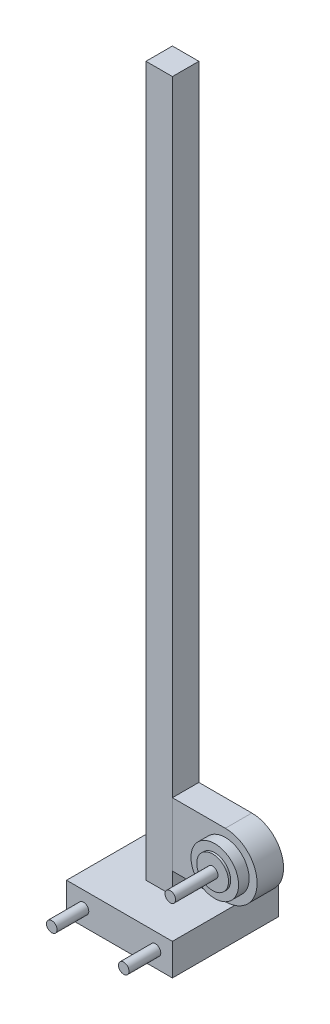
ISO-10303-21;
HEADER;
FILE_DESCRIPTION(('STEP AP214'),'2;1');
FILE_NAME('part.step','',(''),(''),'','','');
FILE_SCHEMA(('AUTOMOTIVE_DESIGN { 1 0 10303 214 1 1 1 1 }'));
ENDSEC;
DATA;
#1=APPLICATION_CONTEXT('core data for automotive mechanical design processes');
#2=APPLICATION_PROTOCOL_DEFINITION('international standard','automotive_design',2000,#1);
#3=PRODUCT_CONTEXT('',#1,'mechanical');
#4=PRODUCT('Part','Part','',(#3));
#5=PRODUCT_RELATED_PRODUCT_CATEGORY('part','',(#4));
#6=PRODUCT_DEFINITION_FORMATION('','',#4);
#7=PRODUCT_DEFINITION_CONTEXT('part definition',#1,'design');
#8=PRODUCT_DEFINITION('design','',#6,#7);
#9=PRODUCT_DEFINITION_SHAPE('','',#8);
#10=(LENGTH_UNIT() NAMED_UNIT(*) SI_UNIT(.MILLI.,.METRE.));
#11=(NAMED_UNIT(*) PLANE_ANGLE_UNIT() SI_UNIT($,.RADIAN.));
#12=(NAMED_UNIT(*) SI_UNIT($,.STERADIAN.) SOLID_ANGLE_UNIT());
#13=UNCERTAINTY_MEASURE_WITH_UNIT(LENGTH_MEASURE(1.E-05),#10,'distance_accuracy_value','');
#14=(GEOMETRIC_REPRESENTATION_CONTEXT(3) GLOBAL_UNCERTAINTY_ASSIGNED_CONTEXT((#13)) GLOBAL_UNIT_ASSIGNED_CONTEXT((#10,
#11,#12)) REPRESENTATION_CONTEXT('',''));
#15=CARTESIAN_POINT('',(0.,0.,0.));
#16=DIRECTION('',(0.,0.,1.));
#17=DIRECTION('',(1.,0.,0.));
#18=AXIS2_PLACEMENT_3D('',#15,#16,#17);
#19=CARTESIAN_POINT('',(75.,80.,52.));
#20=DIRECTION('',(0.,0.,-1.));
#21=DIRECTION('',(-1.,0.,0.));
#22=AXIS2_PLACEMENT_3D('',#19,#20,#21);
#23=CYLINDRICAL_SURFACE('',#22,5.00000000000001);
#24=CARTESIAN_POINT('',(75.,80.,52.));
#25=DIRECTION('',(0.,0.,1.));
#26=DIRECTION('',(1.,0.,0.));
#27=AXIS2_PLACEMENT_3D('',#24,#25,#26);
#28=CIRCLE('',#27,5.00000000000001);
#29=CARTESIAN_POINT('',(80.,80.,52.));
#30=VERTEX_POINT('',#29);
#31=EDGE_CURVE('E11',#30,#30,#28,.T.);
#32=ORIENTED_EDGE('',*,*,#31,.F.);
#33=EDGE_LOOP('',(#32));
#34=FACE_BOUND('',#33,.T.);
#35=CARTESIAN_POINT('',(75.,80.,12.));
#36=DIRECTION('',(0.,0.,1.));
#37=DIRECTION('',(1.,0.,0.));
#38=AXIS2_PLACEMENT_3D('',#35,#36,#37);
#39=CIRCLE('',#38,5.00000000000001);
#40=CARTESIAN_POINT('',(80.,80.,12.));
#41=VERTEX_POINT('',#40);
#42=EDGE_CURVE('E48',#41,#41,#39,.T.);
#43=ORIENTED_EDGE('',*,*,#42,.T.);
#44=EDGE_LOOP('',(#43));
#45=FACE_BOUND('',#44,.T.);
#46=ADVANCED_FACE('F45',(#34,#45),#23,.T.);
#47=CARTESIAN_POINT('',(75.,80.,52.));
#48=DIRECTION('',(0.,0.,1.));
#49=DIRECTION('',(1.,0.,0.));
#50=AXIS2_PLACEMENT_3D('',#47,#48,#49);
#51=PLANE('',#50);
#52=ORIENTED_EDGE('',*,*,#31,.T.);
#53=EDGE_LOOP('',(#52));
#54=FACE_BOUND('',#53,.T.);
#55=ADVANCED_FACE('F60',(#54),#51,.T.);
#56=CARTESIAN_POINT('',(75.,80.,12.));
#57=DIRECTION('',(0.,0.,1.));
#58=DIRECTION('',(1.,0.,0.));
#59=AXIS2_PLACEMENT_3D('',#56,#57,#58);
#60=PLANE('',#59);
#61=ORIENTED_EDGE('',*,*,#42,.F.);
#62=EDGE_LOOP('',(#61));
#63=FACE_BOUND('',#62,.T.);
#64=ADVANCED_FACE('F58',(#63),#60,.F.);
#65=CLOSED_SHELL('',(#46,#55,#64));
#66=MANIFOLD_SOLID_BREP('B2',#65);
#67=CARTESIAN_POINT('',(75.,80.,12.));
#68=DIRECTION('',(0.,0.,-1.));
#69=DIRECTION('',(-1.,0.,0.));
#70=AXIS2_PLACEMENT_3D('',#67,#68,#69);
#71=CYLINDRICAL_SURFACE('',#70,15.);
#72=CARTESIAN_POINT('',(75.,80.,12.));
#73=DIRECTION('',(0.,0.,1.));
#74=DIRECTION('',(1.,0.,0.));
#75=AXIS2_PLACEMENT_3D('',#72,#73,#74);
#76=CIRCLE('',#75,15.);
#77=CARTESIAN_POINT('',(90.,80.,12.));
#78=VERTEX_POINT('',#77);
#79=EDGE_CURVE('E44',#78,#78,#76,.T.);
#80=ORIENTED_EDGE('',*,*,#79,.F.);
#81=EDGE_LOOP('',(#80));
#82=FACE_BOUND('',#81,.T.);
#83=CARTESIAN_POINT('',(75.,80.,10.));
#84=DIRECTION('',(0.,0.,1.));
#85=DIRECTION('',(1.,0.,0.));
#86=AXIS2_PLACEMENT_3D('',#83,#84,#85);
#87=CIRCLE('',#86,15.);
#88=CARTESIAN_POINT('',(90.,80.,10.));
#89=VERTEX_POINT('',#88);
#90=EDGE_CURVE('E102',#89,#89,#87,.T.);
#91=ORIENTED_EDGE('',*,*,#90,.T.);
#92=EDGE_LOOP('',(#91));
#93=FACE_BOUND('',#92,.T.);
#94=ADVANCED_FACE('F99',(#82,#93),#71,.T.);
#95=CARTESIAN_POINT('',(75.,80.,12.));
#96=DIRECTION('',(0.,0.,1.));
#97=DIRECTION('',(1.,0.,0.));
#98=AXIS2_PLACEMENT_3D('',#95,#96,#97);
#99=PLANE('',#98);
#100=ORIENTED_EDGE('',*,*,#79,.T.);
#101=EDGE_LOOP('',(#100));
#102=FACE_BOUND('',#101,.T.);
#103=ADVANCED_FACE('F114',(#102),#99,.T.);
#104=CARTESIAN_POINT('',(75.,80.,10.));
#105=DIRECTION('',(0.,0.,1.));
#106=DIRECTION('',(1.,0.,0.));
#107=AXIS2_PLACEMENT_3D('',#104,#105,#106);
#108=PLANE('',#107);
#109=ORIENTED_EDGE('',*,*,#90,.F.);
#110=EDGE_LOOP('',(#109));
#111=FACE_BOUND('',#110,.T.);
#112=ADVANCED_FACE('F112',(#111),#108,.F.);
#113=CLOSED_SHELL('',(#94,#103,#112));
#114=MANIFOLD_SOLID_BREP('B6',#113);
#115=CARTESIAN_POINT('',(75.,80.,10.));
#116=DIRECTION('',(0.,0.,-1.));
#117=DIRECTION('',(-1.,0.,0.));
#118=AXIS2_PLACEMENT_3D('',#115,#116,#117);
#119=CYLINDRICAL_SURFACE('',#118,22.5);
#120=CARTESIAN_POINT('',(75.,80.,10.));
#121=DIRECTION('',(0.,0.,1.));
#122=DIRECTION('',(1.,0.,0.));
#123=AXIS2_PLACEMENT_3D('',#120,#121,#122);
#124=CIRCLE('',#123,22.5);
#125=CARTESIAN_POINT('',(97.5,80.,10.));
#126=VERTEX_POINT('',#125);
#127=EDGE_CURVE('E98',#126,#126,#124,.T.);
#128=ORIENTED_EDGE('',*,*,#127,.F.);
#129=EDGE_LOOP('',(#128));
#130=FACE_BOUND('',#129,.T.);
#131=CARTESIAN_POINT('',(75.,80.,0.));
#132=DIRECTION('',(0.,0.,1.));
#133=DIRECTION('',(1.,0.,0.));
#134=AXIS2_PLACEMENT_3D('',#131,#132,#133);
#135=CIRCLE('',#134,22.5);
#136=CARTESIAN_POINT('',(97.5,80.,0.));
#137=VERTEX_POINT('',#136);
#138=EDGE_CURVE('E158',#137,#137,#135,.T.);
#139=ORIENTED_EDGE('',*,*,#138,.T.);
#140=EDGE_LOOP('',(#139));
#141=FACE_BOUND('',#140,.T.);
#142=ADVANCED_FACE('F155',(#130,#141),#119,.T.);
#143=CARTESIAN_POINT('',(75.,80.,10.));
#144=DIRECTION('',(0.,0.,1.));
#145=DIRECTION('',(1.,0.,0.));
#146=AXIS2_PLACEMENT_3D('',#143,#144,#145);
#147=PLANE('',#146);
#148=ORIENTED_EDGE('',*,*,#127,.T.);
#149=EDGE_LOOP('',(#148));
#150=FACE_BOUND('',#149,.T.);
#151=ADVANCED_FACE('F170',(#150),#147,.T.);
#152=CARTESIAN_POINT('',(75.,80.,0.));
#153=DIRECTION('',(0.,0.,1.));
#154=DIRECTION('',(1.,0.,0.));
#155=AXIS2_PLACEMENT_3D('',#152,#153,#154);
#156=PLANE('',#155);
#157=ORIENTED_EDGE('',*,*,#138,.F.);
#158=EDGE_LOOP('',(#157));
#159=FACE_BOUND('',#158,.T.);
#160=ADVANCED_FACE('F168',(#159),#156,.F.);
#161=CLOSED_SHELL('',(#142,#151,#160));
#162=MANIFOLD_SOLID_BREP('B39',#161);
#163=CARTESIAN_POINT('',(75.,80.,-125.));
#164=DIRECTION('',(0.,0.,1.));
#165=DIRECTION('',(1.,0.,0.));
#166=AXIS2_PLACEMENT_3D('',#163,#164,#165);
#167=CYLINDRICAL_SURFACE('',#166,30.);
#168=CARTESIAN_POINT('',(75.,80.,-25.));
#169=DIRECTION('',(0.,0.,1.));
#170=DIRECTION('',(1.,0.,0.));
#171=AXIS2_PLACEMENT_3D('',#168,#169,#170);
#172=CIRCLE('',#171,30.);
#173=CARTESIAN_POINT('',(75.,110.,-25.));
#174=VERTEX_POINT('',#173);
#175=CARTESIAN_POINT('',(75.,50.,-25.));
#176=VERTEX_POINT('',#175);
#177=EDGE_CURVE('E218',#174,#176,#172,.F.);
#178=ORIENTED_EDGE('',*,*,#177,.F.);
#179=DIRECTION('',(0.,0.,1.));
#180=VECTOR('',#179,1.);
#181=CARTESIAN_POINT('',(75.,110.,-125.));
#182=LINE('',#181,#180);
#183=CARTESIAN_POINT('',(75.,110.,0.));
#184=VERTEX_POINT('',#183);
#185=EDGE_CURVE('E246',#174,#184,#182,.T.);
#186=ORIENTED_EDGE('',*,*,#185,.T.);
#187=CARTESIAN_POINT('',(75.,80.,0.));
#188=DIRECTION('',(0.,0.,1.));
#189=DIRECTION('',(1.,0.,0.));
#190=AXIS2_PLACEMENT_3D('',#187,#188,#189);
#191=CIRCLE('',#190,30.);
#192=CARTESIAN_POINT('',(75.,50.,0.));
#193=VERTEX_POINT('',#192);
#194=EDGE_CURVE('E250',#193,#184,#191,.T.);
#195=ORIENTED_EDGE('',*,*,#194,.F.);
#196=DIRECTION('',(0.,0.,1.));
#197=VECTOR('',#196,1.);
#198=CARTESIAN_POINT('',(75.,50.,-125.));
#199=LINE('',#198,#197);
#200=EDGE_CURVE('E273',#176,#193,#199,.T.);
#201=ORIENTED_EDGE('',*,*,#200,.F.);
#202=EDGE_LOOP('',(#178,#186,#195,#201));
#203=FACE_BOUND('',#202,.T.);
#204=ADVANCED_FACE('F210',(#203),#167,.T.);
#205=CARTESIAN_POINT('',(25.,50.,-125.));
#206=DIRECTION('',(0.,-1.,0.));
#207=DIRECTION('',(0.,0.,-1.));
#208=AXIS2_PLACEMENT_3D('',#205,#206,#207);
#209=PLANE('',#208);
#210=DIRECTION('',(-1.,0.,0.));
#211=VECTOR('',#210,1.);
#212=CARTESIAN_POINT('',(25.,50.,-25.));
#213=LINE('',#212,#211);
#214=CARTESIAN_POINT('',(25.,50.,-25.));
#215=VERTEX_POINT('',#214);
#216=EDGE_CURVE('E224',#176,#215,#213,.T.);
#217=ORIENTED_EDGE('',*,*,#216,.F.);
#218=ORIENTED_EDGE('',*,*,#200,.T.);
#219=DIRECTION('',(1.,0.,0.));
#220=VECTOR('',#219,1.);
#221=CARTESIAN_POINT('',(25.,50.,0.));
#222=LINE('',#221,#220);
#223=CARTESIAN_POINT('',(25.,50.,0.));
#224=VERTEX_POINT('',#223);
#225=EDGE_CURVE('E255',#224,#193,#222,.T.);
#226=ORIENTED_EDGE('',*,*,#225,.F.);
#227=DIRECTION('',(0.,0.,1.));
#228=VECTOR('',#227,1.);
#229=CARTESIAN_POINT('',(25.,50.,-125.));
#230=LINE('',#229,#228);
#231=EDGE_CURVE('E276',#215,#224,#230,.T.);
#232=ORIENTED_EDGE('',*,*,#231,.F.);
#233=EDGE_LOOP('',(#217,#218,#226,#232));
#234=FACE_BOUND('',#233,.T.);
#235=ADVANCED_FACE('F282',(#234),#209,.T.);
#236=CARTESIAN_POINT('',(25.,110.,-125.));
#237=DIRECTION('',(-1.,0.,0.));
#238=DIRECTION('',(0.,0.,1.));
#239=AXIS2_PLACEMENT_3D('',#236,#237,#238);
#240=PLANE('',#239);
#241=DIRECTION('',(0.,1.,0.));
#242=VECTOR('',#241,1.);
#243=CARTESIAN_POINT('',(25.,110.,-25.));
#244=LINE('',#243,#242);
#245=CARTESIAN_POINT('',(25.,110.,-25.));
#246=VERTEX_POINT('',#245);
#247=EDGE_CURVE('E275',#215,#246,#244,.T.);
#248=ORIENTED_EDGE('',*,*,#247,.F.);
#249=ORIENTED_EDGE('',*,*,#231,.T.);
#250=DIRECTION('',(0.,-1.,0.));
#251=VECTOR('',#250,1.);
#252=CARTESIAN_POINT('',(25.,110.,0.));
#253=LINE('',#252,#251);
#254=CARTESIAN_POINT('',(25.,110.,0.));
#255=VERTEX_POINT('',#254);
#256=EDGE_CURVE('E263',#255,#224,#253,.T.);
#257=ORIENTED_EDGE('',*,*,#256,.F.);
#258=DIRECTION('',(0.,0.,1.));
#259=VECTOR('',#258,1.);
#260=CARTESIAN_POINT('',(25.,110.,-125.));
#261=LINE('',#260,#259);
#262=EDGE_CURVE('E254',#246,#255,#261,.T.);
#263=ORIENTED_EDGE('',*,*,#262,.F.);
#264=EDGE_LOOP('',(#248,#249,#257,#263));
#265=FACE_BOUND('',#264,.T.);
#266=ADVANCED_FACE('F280',(#265),#240,.T.);
#267=CARTESIAN_POINT('',(75.,110.,-125.));
#268=DIRECTION('',(0.,1.,0.));
#269=DIRECTION('',(0.,0.,1.));
#270=AXIS2_PLACEMENT_3D('',#267,#268,#269);
#271=PLANE('',#270);
#272=DIRECTION('',(1.,0.,0.));
#273=VECTOR('',#272,1.);
#274=CARTESIAN_POINT('',(75.,110.,-25.));
#275=LINE('',#274,#273);
#276=EDGE_CURVE('E153',#246,#174,#275,.T.);
#277=ORIENTED_EDGE('',*,*,#276,.F.);
#278=ORIENTED_EDGE('',*,*,#262,.T.);
#279=DIRECTION('',(-1.,0.,0.));
#280=VECTOR('',#279,1.);
#281=CARTESIAN_POINT('',(75.,110.,0.));
#282=LINE('',#281,#280);
#283=EDGE_CURVE('E257',#184,#255,#282,.T.);
#284=ORIENTED_EDGE('',*,*,#283,.F.);
#285=ORIENTED_EDGE('',*,*,#185,.F.);
#286=EDGE_LOOP('',(#277,#278,#284,#285));
#287=FACE_BOUND('',#286,.T.);
#288=ADVANCED_FACE('F258',(#287),#271,.T.);
#289=CARTESIAN_POINT('',(75.,80.,0.));
#290=DIRECTION('',(0.,0.,1.));
#291=DIRECTION('',(1.,0.,0.));
#292=AXIS2_PLACEMENT_3D('',#289,#290,#291);
#293=PLANE('',#292);
#294=ORIENTED_EDGE('',*,*,#194,.T.);
#295=ORIENTED_EDGE('',*,*,#283,.T.);
#296=ORIENTED_EDGE('',*,*,#256,.T.);
#297=ORIENTED_EDGE('',*,*,#225,.T.);
#298=EDGE_LOOP('',(#294,#295,#296,#297));
#299=FACE_BOUND('',#298,.T.);
#300=ADVANCED_FACE('F265',(#299),#293,.T.);
#301=CARTESIAN_POINT('',(25.,700.,-25.));
#302=DIRECTION('',(0.,0.,1.));
#303=DIRECTION('',(1.,0.,0.));
#304=AXIS2_PLACEMENT_3D('',#301,#302,#303);
#305=PLANE('',#304);
#306=ORIENTED_EDGE('',*,*,#177,.T.);
#307=ORIENTED_EDGE('',*,*,#216,.T.);
#308=ORIENTED_EDGE('',*,*,#247,.T.);
#309=ORIENTED_EDGE('',*,*,#276,.T.);
#310=EDGE_LOOP('',(#306,#307,#308,#309));
#311=FACE_BOUND('',#310,.T.);
#312=ADVANCED_FACE('F284',(#311),#305,.F.);
#313=CLOSED_SHELL('',(#204,#235,#266,#288,#300,#312));
#314=MANIFOLD_SOLID_BREP('B93',#313);
#315=CARTESIAN_POINT('',(0.,700.,-25.));
#316=DIRECTION('',(1.,0.,0.));
#317=DIRECTION('',(0.,0.,-1.));
#318=AXIS2_PLACEMENT_3D('',#315,#316,#317);
#319=PLANE('',#318);
#320=DIRECTION('',(0.,-1.,0.));
#321=VECTOR('',#320,1.);
#322=CARTESIAN_POINT('',(0.,700.,-25.));
#323=LINE('',#322,#321);
#324=CARTESIAN_POINT('',(0.,700.,-25.));
#325=VERTEX_POINT('',#324);
#326=CARTESIAN_POINT('',(0.,30.,-25.));
#327=VERTEX_POINT('',#326);
#328=EDGE_CURVE('E454',#325,#327,#323,.T.);
#329=ORIENTED_EDGE('',*,*,#328,.T.);
#330=DIRECTION('',(0.,0.,1.));
#331=VECTOR('',#330,1.);
#332=CARTESIAN_POINT('',(0.,30.,-25.));
#333=LINE('',#332,#331);
#334=CARTESIAN_POINT('',(0.,30.,0.));
#335=VERTEX_POINT('',#334);
#336=EDGE_CURVE('E359',#327,#335,#333,.T.);
#337=ORIENTED_EDGE('',*,*,#336,.T.);
#338=DIRECTION('',(0.,-1.,0.));
#339=VECTOR('',#338,1.);
#340=CARTESIAN_POINT('',(0.,700.,0.));
#341=LINE('',#340,#339);
#342=CARTESIAN_POINT('',(0.,700.,0.));
#343=VERTEX_POINT('',#342);
#344=EDGE_CURVE('E463',#343,#335,#341,.T.);
#345=ORIENTED_EDGE('',*,*,#344,.F.);
#346=DIRECTION('',(0.,0.,1.));
#347=VECTOR('',#346,1.);
#348=CARTESIAN_POINT('',(0.,700.,-25.));
#349=LINE('',#348,#347);
#350=EDGE_CURVE('E447',#325,#343,#349,.T.);
#351=ORIENTED_EDGE('',*,*,#350,.F.);
#352=EDGE_LOOP('',(#329,#337,#345,#351));
#353=FACE_BOUND('',#352,.T.);
#354=ADVANCED_FACE('F345',(#353),#319,.F.);
#355=CARTESIAN_POINT('',(0.,700.,0.));
#356=DIRECTION('',(0.,0.,-1.));
#357=DIRECTION('',(-1.,0.,0.));
#358=AXIS2_PLACEMENT_3D('',#355,#356,#357);
#359=PLANE('',#358);
#360=ORIENTED_EDGE('',*,*,#344,.T.);
#361=DIRECTION('',(1.,0.,0.));
#362=VECTOR('',#361,1.);
#363=CARTESIAN_POINT('',(0.,30.,0.));
#364=LINE('',#363,#362);
#365=CARTESIAN_POINT('',(25.,30.,0.));
#366=VERTEX_POINT('',#365);
#367=EDGE_CURVE('E438',#335,#366,#364,.T.);
#368=ORIENTED_EDGE('',*,*,#367,.T.);
#369=DIRECTION('',(0.,-1.,0.));
#370=VECTOR('',#369,1.);
#371=CARTESIAN_POINT('',(25.,700.,0.));
#372=LINE('',#371,#370);
#373=CARTESIAN_POINT('',(25.,700.,0.));
#374=VERTEX_POINT('',#373);
#375=EDGE_CURVE('E460',#374,#366,#372,.T.);
#376=ORIENTED_EDGE('',*,*,#375,.F.);
#377=DIRECTION('',(1.,0.,0.));
#378=VECTOR('',#377,1.);
#379=CARTESIAN_POINT('',(0.,700.,0.));
#380=LINE('',#379,#378);
#381=EDGE_CURVE('E449',#343,#374,#380,.T.);
#382=ORIENTED_EDGE('',*,*,#381,.F.);
#383=EDGE_LOOP('',(#360,#368,#376,#382));
#384=FACE_BOUND('',#383,.T.);
#385=ADVANCED_FACE('F486',(#384),#359,.F.);
#386=CARTESIAN_POINT('',(25.,700.,0.));
#387=DIRECTION('',(-1.,0.,0.));
#388=DIRECTION('',(0.,0.,1.));
#389=AXIS2_PLACEMENT_3D('',#386,#387,#388);
#390=PLANE('',#389);
#391=ORIENTED_EDGE('',*,*,#375,.T.);
#392=DIRECTION('',(0.,0.,-1.));
#393=VECTOR('',#392,1.);
#394=CARTESIAN_POINT('',(25.,30.,0.));
#395=LINE('',#394,#393);
#396=CARTESIAN_POINT('',(25.,30.,-25.));
#397=VERTEX_POINT('',#396);
#398=EDGE_CURVE('E435',#366,#397,#395,.T.);
#399=ORIENTED_EDGE('',*,*,#398,.T.);
#400=DIRECTION('',(0.,-1.,0.));
#401=VECTOR('',#400,1.);
#402=CARTESIAN_POINT('',(25.,700.,-25.));
#403=LINE('',#402,#401);
#404=CARTESIAN_POINT('',(25.,700.,-25.));
#405=VERTEX_POINT('',#404);
#406=EDGE_CURVE('E457',#405,#397,#403,.T.);
#407=ORIENTED_EDGE('',*,*,#406,.F.);
#408=DIRECTION('',(0.,0.,-1.));
#409=VECTOR('',#408,1.);
#410=CARTESIAN_POINT('',(25.,700.,0.));
#411=LINE('',#410,#409);
#412=EDGE_CURVE('E451',#374,#405,#411,.T.);
#413=ORIENTED_EDGE('',*,*,#412,.F.);
#414=EDGE_LOOP('',(#391,#399,#407,#413));
#415=FACE_BOUND('',#414,.T.);
#416=ADVANCED_FACE('F491',(#415),#390,.F.);
#417=CARTESIAN_POINT('',(25.,700.,-25.));
#418=DIRECTION('',(0.,0.,1.));
#419=DIRECTION('',(1.,0.,0.));
#420=AXIS2_PLACEMENT_3D('',#417,#418,#419);
#421=PLANE('',#420);
#422=ORIENTED_EDGE('',*,*,#406,.T.);
#423=DIRECTION('',(-1.,0.,0.));
#424=VECTOR('',#423,1.);
#425=CARTESIAN_POINT('',(25.,30.,-25.));
#426=LINE('',#425,#424);
#427=EDGE_CURVE('E466',#397,#327,#426,.T.);
#428=ORIENTED_EDGE('',*,*,#427,.T.);
#429=ORIENTED_EDGE('',*,*,#328,.F.);
#430=DIRECTION('',(-1.,0.,0.));
#431=VECTOR('',#430,1.);
#432=CARTESIAN_POINT('',(25.,700.,-25.));
#433=LINE('',#432,#431);
#434=EDGE_CURVE('E367',#405,#325,#433,.T.);
#435=ORIENTED_EDGE('',*,*,#434,.F.);
#436=EDGE_LOOP('',(#422,#428,#429,#435));
#437=FACE_BOUND('',#436,.T.);
#438=ADVANCED_FACE('F496',(#437),#421,.F.);
#439=CARTESIAN_POINT('',(0.,700.,0.));
#440=DIRECTION('',(0.,1.,0.));
#441=DIRECTION('',(0.,0.,1.));
#442=AXIS2_PLACEMENT_3D('',#439,#440,#441);
#443=PLANE('',#442);
#444=ORIENTED_EDGE('',*,*,#350,.T.);
#445=ORIENTED_EDGE('',*,*,#381,.T.);
#446=ORIENTED_EDGE('',*,*,#412,.T.);
#447=ORIENTED_EDGE('',*,*,#434,.T.);
#448=EDGE_LOOP('',(#444,#445,#446,#447));
#449=FACE_BOUND('',#448,.T.);
#450=ADVANCED_FACE('F501',(#449),#443,.T.);
#451=CARTESIAN_POINT('',(0.,30.,0.));
#452=DIRECTION('',(0.,1.,0.));
#453=DIRECTION('',(0.,0.,1.));
#454=AXIS2_PLACEMENT_3D('',#451,#452,#453);
#455=PLANE('',#454);
#456=DIRECTION('',(0.,0.,1.));
#457=VECTOR('',#456,1.);
#458=CARTESIAN_POINT('',(-37.5,30.,-62.5));
#459=LINE('',#458,#457);
#460=CARTESIAN_POINT('',(-37.5,30.,-62.5));
#461=VERTEX_POINT('',#460);
#462=CARTESIAN_POINT('',(-37.5,30.,37.5));
#463=VERTEX_POINT('',#462);
#464=EDGE_CURVE('E421',#461,#463,#459,.T.);
#465=ORIENTED_EDGE('',*,*,#464,.T.);
#466=DIRECTION('',(1.,0.,0.));
#467=VECTOR('',#466,1.);
#468=CARTESIAN_POINT('',(-37.5,30.,37.5));
#469=LINE('',#468,#467);
#470=CARTESIAN_POINT('',(62.5,30.,37.5));
#471=VERTEX_POINT('',#470);
#472=EDGE_CURVE('E410',#463,#471,#469,.T.);
#473=ORIENTED_EDGE('',*,*,#472,.T.);
#474=DIRECTION('',(0.,0.,-1.));
#475=VECTOR('',#474,1.);
#476=CARTESIAN_POINT('',(62.5,30.,37.5));
#477=LINE('',#476,#475);
#478=CARTESIAN_POINT('',(62.5,30.,-62.5));
#479=VERTEX_POINT('',#478);
#480=EDGE_CURVE('E420',#471,#479,#477,.T.);
#481=ORIENTED_EDGE('',*,*,#480,.T.);
#482=DIRECTION('',(-1.,0.,0.));
#483=VECTOR('',#482,1.);
#484=CARTESIAN_POINT('',(62.5,30.,-62.5));
#485=LINE('',#484,#483);
#486=EDGE_CURVE('E426',#479,#461,#485,.T.);
#487=ORIENTED_EDGE('',*,*,#486,.T.);
#488=EDGE_LOOP('',(#465,#473,#481,#487));
#489=FACE_BOUND('',#488,.T.);
#490=ORIENTED_EDGE('',*,*,#336,.F.);
#491=ORIENTED_EDGE('',*,*,#427,.F.);
#492=ORIENTED_EDGE('',*,*,#398,.F.);
#493=ORIENTED_EDGE('',*,*,#367,.F.);
#494=EDGE_LOOP('',(#490,#491,#492,#493));
#495=FACE_BOUND('',#494,.T.);
#496=ADVANCED_FACE('F424',(#489,#495),#455,.T.);
#497=CARTESIAN_POINT('',(-37.5,30.,-62.5));
#498=DIRECTION('',(1.,0.,0.));
#499=DIRECTION('',(0.,0.,-1.));
#500=AXIS2_PLACEMENT_3D('',#497,#498,#499);
#501=PLANE('',#500);
#502=DIRECTION('',(0.,0.,1.));
#503=VECTOR('',#502,1.);
#504=CARTESIAN_POINT('',(-37.5,0.,-62.5));
#505=LINE('',#504,#503);
#506=CARTESIAN_POINT('',(-37.5,0.,-62.5));
#507=VERTEX_POINT('',#506);
#508=CARTESIAN_POINT('',(-37.5,0.,37.5));
#509=VERTEX_POINT('',#508);
#510=EDGE_CURVE('E434',#507,#509,#505,.T.);
#511=ORIENTED_EDGE('',*,*,#510,.T.);
#512=DIRECTION('',(0.,-1.,0.));
#513=VECTOR('',#512,1.);
#514=CARTESIAN_POINT('',(-37.5,30.,37.5));
#515=LINE('',#514,#513);
#516=EDGE_CURVE('E414',#463,#509,#515,.T.);
#517=ORIENTED_EDGE('',*,*,#516,.F.);
#518=ORIENTED_EDGE('',*,*,#464,.F.);
#519=DIRECTION('',(0.,-1.,0.));
#520=VECTOR('',#519,1.);
#521=CARTESIAN_POINT('',(-37.5,30.,-62.5));
#522=LINE('',#521,#520);
#523=EDGE_CURVE('E661',#461,#507,#522,.T.);
#524=ORIENTED_EDGE('',*,*,#523,.T.);
#525=EDGE_LOOP('',(#511,#517,#518,#524));
#526=FACE_BOUND('',#525,.T.);
#527=ADVANCED_FACE('F432',(#526),#501,.F.);
#528=CARTESIAN_POINT('',(-37.5,30.,37.5));
#529=DIRECTION('',(0.,0.,-1.));
#530=DIRECTION('',(-1.,0.,0.));
#531=AXIS2_PLACEMENT_3D('',#528,#529,#530);
#532=PLANE('',#531);
#533=CARTESIAN_POINT('',(46.5,15.,37.5));
#534=DIRECTION('',(0.,0.,-1.));
#535=DIRECTION('',(-1.,0.,0.));
#536=AXIS2_PLACEMENT_3D('',#533,#534,#535);
#537=CIRCLE('',#536,5.);
#538=CARTESIAN_POINT('',(41.5,15.,37.5));
#539=VERTEX_POINT('',#538);
#540=EDGE_CURVE('E208',#539,#539,#537,.F.);
#541=ORIENTED_EDGE('',*,*,#540,.F.);
#542=EDGE_LOOP('',(#541));
#543=FACE_BOUND('',#542,.T.);
#544=CARTESIAN_POINT('',(-21.5,15.,37.5));
#545=DIRECTION('',(0.,0.,-1.));
#546=DIRECTION('',(-1.,0.,0.));
#547=AXIS2_PLACEMENT_3D('',#544,#545,#546);
#548=CIRCLE('',#547,5.);
#549=CARTESIAN_POINT('',(-26.5,15.,37.5));
#550=VERTEX_POINT('',#549);
#551=EDGE_CURVE('E352',#550,#550,#548,.F.);
#552=ORIENTED_EDGE('',*,*,#551,.F.);
#553=EDGE_LOOP('',(#552));
#554=FACE_BOUND('',#553,.T.);
#555=DIRECTION('',(1.,0.,0.));
#556=VECTOR('',#555,1.);
#557=CARTESIAN_POINT('',(-37.5,0.,37.5));
#558=LINE('',#557,#556);
#559=CARTESIAN_POINT('',(62.5,0.,37.5));
#560=VERTEX_POINT('',#559);
#561=EDGE_CURVE('E663',#509,#560,#558,.T.);
#562=ORIENTED_EDGE('',*,*,#561,.T.);
#563=DIRECTION('',(0.,-1.,0.));
#564=VECTOR('',#563,1.);
#565=CARTESIAN_POINT('',(62.5,30.,37.5));
#566=LINE('',#565,#564);
#567=EDGE_CURVE('E417',#471,#560,#566,.T.);
#568=ORIENTED_EDGE('',*,*,#567,.F.);
#569=ORIENTED_EDGE('',*,*,#472,.F.);
#570=ORIENTED_EDGE('',*,*,#516,.T.);
#571=EDGE_LOOP('',(#562,#568,#569,#570));
#572=FACE_BOUND('',#571,.T.);
#573=ADVANCED_FACE('F412',(#543,#554,#572),#532,.F.);
#574=CARTESIAN_POINT('',(62.5,30.,37.5));
#575=DIRECTION('',(-1.,0.,0.));
#576=DIRECTION('',(0.,0.,1.));
#577=AXIS2_PLACEMENT_3D('',#574,#575,#576);
#578=PLANE('',#577);
#579=DIRECTION('',(0.,0.,-1.));
#580=VECTOR('',#579,1.);
#581=CARTESIAN_POINT('',(62.5,0.,37.5));
#582=LINE('',#581,#580);
#583=CARTESIAN_POINT('',(62.5,0.,-62.5));
#584=VERTEX_POINT('',#583);
#585=EDGE_CURVE('E665',#560,#584,#582,.T.);
#586=ORIENTED_EDGE('',*,*,#585,.T.);
#587=DIRECTION('',(0.,-1.,0.));
#588=VECTOR('',#587,1.);
#589=CARTESIAN_POINT('',(62.5,30.,-62.5));
#590=LINE('',#589,#588);
#591=EDGE_CURVE('E440',#479,#584,#590,.T.);
#592=ORIENTED_EDGE('',*,*,#591,.F.);
#593=ORIENTED_EDGE('',*,*,#480,.F.);
#594=ORIENTED_EDGE('',*,*,#567,.T.);
#595=EDGE_LOOP('',(#586,#592,#593,#594));
#596=FACE_BOUND('',#595,.T.);
#597=ADVANCED_FACE('F473',(#596),#578,.F.);
#598=CARTESIAN_POINT('',(62.5,30.,-62.5));
#599=DIRECTION('',(0.,0.,1.));
#600=DIRECTION('',(1.,0.,0.));
#601=AXIS2_PLACEMENT_3D('',#598,#599,#600);
#602=PLANE('',#601);
#603=DIRECTION('',(-1.,0.,0.));
#604=VECTOR('',#603,1.);
#605=CARTESIAN_POINT('',(62.5,0.,-62.5));
#606=LINE('',#605,#604);
#607=EDGE_CURVE('E430',#584,#507,#606,.T.);
#608=ORIENTED_EDGE('',*,*,#607,.T.);
#609=ORIENTED_EDGE('',*,*,#523,.F.);
#610=ORIENTED_EDGE('',*,*,#486,.F.);
#611=ORIENTED_EDGE('',*,*,#591,.T.);
#612=EDGE_LOOP('',(#608,#609,#610,#611));
#613=FACE_BOUND('',#612,.T.);
#614=ADVANCED_FACE('F480',(#613),#602,.F.);
#615=CARTESIAN_POINT('',(0.,0.,0.));
#616=DIRECTION('',(0.,1.,0.));
#617=DIRECTION('',(0.,0.,1.));
#618=AXIS2_PLACEMENT_3D('',#615,#616,#617);
#619=PLANE('',#618);
#620=ORIENTED_EDGE('',*,*,#510,.F.);
#621=ORIENTED_EDGE('',*,*,#607,.F.);
#622=ORIENTED_EDGE('',*,*,#585,.F.);
#623=ORIENTED_EDGE('',*,*,#561,.F.);
#624=EDGE_LOOP('',(#620,#621,#622,#623));
#625=FACE_BOUND('',#624,.T.);
#626=ADVANCED_FACE('F511',(#625),#619,.F.);
#627=CARTESIAN_POINT('',(-21.5,15.,67.5));
#628=DIRECTION('',(0.,0.,-1.));
#629=DIRECTION('',(-1.,0.,0.));
#630=AXIS2_PLACEMENT_3D('',#627,#628,#629);
#631=CYLINDRICAL_SURFACE('',#630,5.);
#632=CARTESIAN_POINT('',(-21.5,15.,67.5));
#633=DIRECTION('',(0.,0.,1.));
#634=DIRECTION('',(1.,0.,0.));
#635=AXIS2_PLACEMENT_3D('',#632,#633,#634);
#636=CIRCLE('',#635,5.);
#637=CARTESIAN_POINT('',(-16.5,15.,67.5));
#638=VERTEX_POINT('',#637);
#639=EDGE_CURVE('E654',#638,#638,#636,.T.);
#640=ORIENTED_EDGE('',*,*,#639,.F.);
#641=EDGE_LOOP('',(#640));
#642=FACE_BOUND('',#641,.T.);
#643=ORIENTED_EDGE('',*,*,#551,.T.);
#644=EDGE_LOOP('',(#643));
#645=FACE_BOUND('',#644,.T.);
#646=ADVANCED_FACE('F470',(#642,#645),#631,.T.);
#647=CARTESIAN_POINT('',(-21.5,15.,67.5));
#648=DIRECTION('',(0.,0.,1.));
#649=DIRECTION('',(1.,0.,0.));
#650=AXIS2_PLACEMENT_3D('',#647,#648,#649);
#651=PLANE('',#650);
#652=ORIENTED_EDGE('',*,*,#639,.T.);
#653=EDGE_LOOP('',(#652));
#654=FACE_BOUND('',#653,.T.);
#655=ADVANCED_FACE('F578',(#654),#651,.T.);
#656=CARTESIAN_POINT('',(46.5,15.,67.5));
#657=DIRECTION('',(0.,0.,-1.));
#658=DIRECTION('',(-1.,0.,0.));
#659=AXIS2_PLACEMENT_3D('',#656,#657,#658);
#660=CYLINDRICAL_SURFACE('',#659,5.);
#661=CARTESIAN_POINT('',(46.5,15.,67.5));
#662=DIRECTION('',(0.,0.,1.));
#663=DIRECTION('',(1.,0.,0.));
#664=AXIS2_PLACEMENT_3D('',#661,#662,#663);
#665=CIRCLE('',#664,5.);
#666=CARTESIAN_POINT('',(51.5,15.,67.5));
#667=VERTEX_POINT('',#666);
#668=EDGE_CURVE('E653',#667,#667,#665,.T.);
#669=ORIENTED_EDGE('',*,*,#668,.F.);
#670=EDGE_LOOP('',(#669));
#671=FACE_BOUND('',#670,.T.);
#672=ORIENTED_EDGE('',*,*,#540,.T.);
#673=EDGE_LOOP('',(#672));
#674=FACE_BOUND('',#673,.T.);
#675=ADVANCED_FACE('F589',(#671,#674),#660,.T.);
#676=CARTESIAN_POINT('',(46.5,15.,67.5));
#677=DIRECTION('',(0.,0.,1.));
#678=DIRECTION('',(1.,0.,0.));
#679=AXIS2_PLACEMENT_3D('',#676,#677,#678);
#680=PLANE('',#679);
#681=ORIENTED_EDGE('',*,*,#668,.T.);
#682=EDGE_LOOP('',(#681));
#683=FACE_BOUND('',#682,.T.);
#684=ADVANCED_FACE('F600',(#683),#680,.T.);
#685=CLOSED_SHELL('',(#354,#385,#416,#438,#450,#496,#527,#573,#597,#614,#626,#646,#655,#675,#684));
#686=MANIFOLD_SOLID_BREP('B147',#685);
#687=ADVANCED_BREP_SHAPE_REPRESENTATION('',(#18,#66,#114,#162,#314,#686),#14);
#688=SHAPE_DEFINITION_REPRESENTATION(#9,#687);
ENDSEC;
END-ISO-10303-21;
